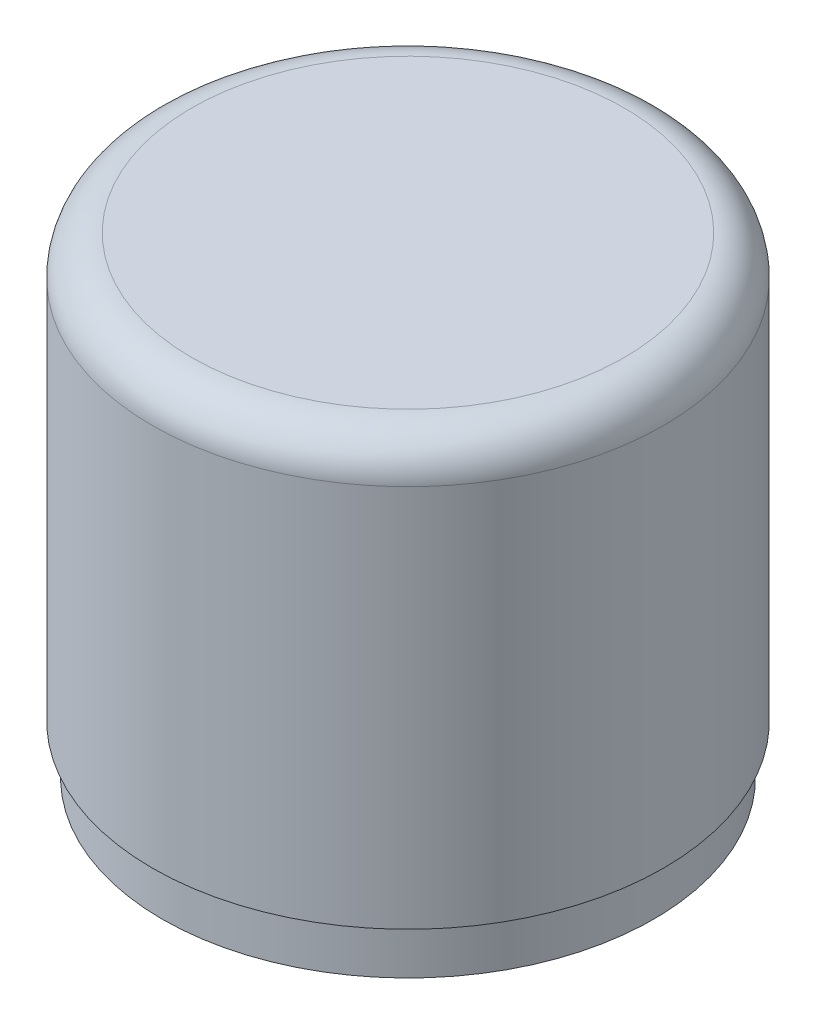
ISO-10303-21;
HEADER;
FILE_DESCRIPTION(('STEP AP214'),'2;1');
FILE_NAME('part.step','',(''),(''),'','','');
FILE_SCHEMA(('AUTOMOTIVE_DESIGN { 1 0 10303 214 1 1 1 1 }'));
ENDSEC;
DATA;
#1=APPLICATION_CONTEXT('core data for automotive mechanical design processes');
#2=APPLICATION_PROTOCOL_DEFINITION('international standard','automotive_design',2000,#1);
#3=PRODUCT_CONTEXT('',#1,'mechanical');
#4=PRODUCT('Part','Part','',(#3));
#5=PRODUCT_RELATED_PRODUCT_CATEGORY('part','',(#4));
#6=PRODUCT_DEFINITION_FORMATION('','',#4);
#7=PRODUCT_DEFINITION_CONTEXT('part definition',#1,'design');
#8=PRODUCT_DEFINITION('design','',#6,#7);
#9=PRODUCT_DEFINITION_SHAPE('','',#8);
#10=(LENGTH_UNIT() NAMED_UNIT(*) SI_UNIT(.MILLI.,.METRE.));
#11=(NAMED_UNIT(*) PLANE_ANGLE_UNIT() SI_UNIT($,.RADIAN.));
#12=(NAMED_UNIT(*) SI_UNIT($,.STERADIAN.) SOLID_ANGLE_UNIT());
#13=UNCERTAINTY_MEASURE_WITH_UNIT(LENGTH_MEASURE(1.E-05),#10,'distance_accuracy_value','');
#14=(GEOMETRIC_REPRESENTATION_CONTEXT(3) GLOBAL_UNCERTAINTY_ASSIGNED_CONTEXT((#13)) GLOBAL_UNIT_ASSIGNED_CONTEXT((#10,
#11,#12)) REPRESENTATION_CONTEXT('',''));
#15=CARTESIAN_POINT('',(0.,0.,0.));
#16=DIRECTION('',(0.,0.,1.));
#17=DIRECTION('',(1.,0.,0.));
#18=AXIS2_PLACEMENT_3D('',#15,#16,#17);
#19=CARTESIAN_POINT('',(0.,43.,0.));
#20=DIRECTION('',(0.,-1.,0.));
#21=DIRECTION('',(0.,0.,-1.));
#22=AXIS2_PLACEMENT_3D('',#19,#20,#21);
#23=CYLINDRICAL_SURFACE('',#22,26.);
#24=CARTESIAN_POINT('',(0.,39.,0.));
#25=DIRECTION('',(0.,1.,0.));
#26=DIRECTION('',(0.,0.,1.));
#27=AXIS2_PLACEMENT_3D('',#24,#25,#26);
#28=CIRCLE('',#27,26.);
#29=CARTESIAN_POINT('',(0.,39.,26.));
#30=VERTEX_POINT('',#29);
#31=EDGE_CURVE('E10',#30,#30,#28,.F.);
#32=ORIENTED_EDGE('',*,*,#31,.T.);
#33=EDGE_LOOP('',(#32));
#34=FACE_BOUND('',#33,.T.);
#35=CARTESIAN_POINT('',(0.,0.,0.));
#36=DIRECTION('',(0.,1.,0.));
#37=DIRECTION('',(0.,0.,1.));
#38=AXIS2_PLACEMENT_3D('',#35,#36,#37);
#39=CIRCLE('',#38,26.);
#40=CARTESIAN_POINT('',(0.,0.,26.));
#41=VERTEX_POINT('',#40);
#42=EDGE_CURVE('E55',#41,#41,#39,.T.);
#43=ORIENTED_EDGE('',*,*,#42,.T.);
#44=EDGE_LOOP('',(#43));
#45=FACE_BOUND('',#44,.T.);
#46=ADVANCED_FACE('F40',(#34,#45),#23,.T.);
#47=CARTESIAN_POINT('',(0.,43.,0.));
#48=DIRECTION('',(0.,1.,0.));
#49=DIRECTION('',(0.,0.,1.));
#50=AXIS2_PLACEMENT_3D('',#47,#48,#49);
#51=PLANE('',#50);
#52=CARTESIAN_POINT('',(0.,43.,0.));
#53=DIRECTION('',(0.,1.,0.));
#54=DIRECTION('',(0.,0.,1.));
#55=AXIS2_PLACEMENT_3D('',#52,#53,#54);
#56=CIRCLE('',#55,22.);
#57=CARTESIAN_POINT('',(0.,43.,22.));
#58=VERTEX_POINT('',#57);
#59=EDGE_CURVE('E47',#58,#58,#56,.T.);
#60=ORIENTED_EDGE('',*,*,#59,.T.);
#61=EDGE_LOOP('',(#60));
#62=FACE_BOUND('',#61,.T.);
#63=ADVANCED_FACE('F93',(#62),#51,.T.);
#64=CARTESIAN_POINT('',(0.,0.,0.));
#65=DIRECTION('',(0.,1.,0.));
#66=DIRECTION('',(0.,0.,1.));
#67=AXIS2_PLACEMENT_3D('',#64,#65,#66);
#68=PLANE('',#67);
#69=CARTESIAN_POINT('',(0.,0.,0.));
#70=DIRECTION('',(0.,-1.,0.));
#71=DIRECTION('',(0.,0.,-1.));
#72=AXIS2_PLACEMENT_3D('',#69,#70,#71);
#73=CIRCLE('',#72,25.);
#74=CARTESIAN_POINT('',(0.,0.,-25.));
#75=VERTEX_POINT('',#74);
#76=EDGE_CURVE('E51',#75,#75,#73,.T.);
#77=ORIENTED_EDGE('',*,*,#76,.F.);
#78=EDGE_LOOP('',(#77));
#79=FACE_BOUND('',#78,.T.);
#80=ORIENTED_EDGE('',*,*,#42,.F.);
#81=EDGE_LOOP('',(#80));
#82=FACE_BOUND('',#81,.T.);
#83=ADVANCED_FACE('F87',(#79,#82),#68,.F.);
#84=CARTESIAN_POINT('',(0.,-5.,0.));
#85=DIRECTION('',(0.,1.,0.));
#86=DIRECTION('',(0.,0.,1.));
#87=AXIS2_PLACEMENT_3D('',#84,#85,#86);
#88=CYLINDRICAL_SURFACE('',#87,25.);
#89=CARTESIAN_POINT('',(0.,-5.,0.));
#90=DIRECTION('',(0.,-1.,0.));
#91=DIRECTION('',(0.,0.,-1.));
#92=AXIS2_PLACEMENT_3D('',#89,#90,#91);
#93=CIRCLE('',#92,25.);
#94=CARTESIAN_POINT('',(0.,-5.,-25.));
#95=VERTEX_POINT('',#94);
#96=EDGE_CURVE('E59',#95,#95,#93,.T.);
#97=ORIENTED_EDGE('',*,*,#96,.F.);
#98=EDGE_LOOP('',(#97));
#99=FACE_BOUND('',#98,.T.);
#100=ORIENTED_EDGE('',*,*,#76,.T.);
#101=EDGE_LOOP('',(#100));
#102=FACE_BOUND('',#101,.T.);
#103=ADVANCED_FACE('F81',(#99,#102),#88,.T.);
#104=CARTESIAN_POINT('',(0.,-5.,0.));
#105=DIRECTION('',(0.,-1.,0.));
#106=DIRECTION('',(0.,0.,-1.));
#107=AXIS2_PLACEMENT_3D('',#104,#105,#106);
#108=PLANE('',#107);
#109=CARTESIAN_POINT('',(0.,-5.,0.));
#110=DIRECTION('',(0.,-1.,0.));
#111=DIRECTION('',(0.,0.,-1.));
#112=AXIS2_PLACEMENT_3D('',#109,#110,#111);
#113=CIRCLE('',#112,24.1458786133638);
#114=CARTESIAN_POINT('',(0.,-5.,-24.1458786133638));
#115=VERTEX_POINT('',#114);
#116=EDGE_CURVE('E64',#115,#115,#113,.T.);
#117=ORIENTED_EDGE('',*,*,#116,.F.);
#118=EDGE_LOOP('',(#117));
#119=FACE_BOUND('',#118,.T.);
#120=ORIENTED_EDGE('',*,*,#96,.T.);
#121=EDGE_LOOP('',(#120));
#122=FACE_BOUND('',#121,.T.);
#123=ADVANCED_FACE('F75',(#119,#122),#108,.T.);
#124=CARTESIAN_POINT('',(0.,39.,0.));
#125=DIRECTION('',(0.,-1.,0.));
#126=DIRECTION('',(0.,0.,-1.));
#127=AXIS2_PLACEMENT_3D('',#124,#125,#126);
#128=CYLINDRICAL_SURFACE('',#127,24.1458786133638);
#129=CARTESIAN_POINT('',(0.,39.,0.));
#130=DIRECTION('',(0.,-1.,0.));
#131=DIRECTION('',(0.,0.,-1.));
#132=AXIS2_PLACEMENT_3D('',#129,#130,#131);
#133=CIRCLE('',#132,24.1458786133638);
#134=CARTESIAN_POINT('',(0.,39.,-24.1458786133638));
#135=VERTEX_POINT('',#134);
#136=EDGE_CURVE('E63',#135,#135,#133,.T.);
#137=ORIENTED_EDGE('',*,*,#136,.F.);
#138=EDGE_LOOP('',(#137));
#139=FACE_BOUND('',#138,.T.);
#140=ORIENTED_EDGE('',*,*,#116,.T.);
#141=EDGE_LOOP('',(#140));
#142=FACE_BOUND('',#141,.T.);
#143=ADVANCED_FACE('F72',(#139,#142),#128,.F.);
#144=CARTESIAN_POINT('',(0.,39.,0.));
#145=DIRECTION('',(0.,-1.,0.));
#146=DIRECTION('',(0.,0.,-1.));
#147=AXIS2_PLACEMENT_3D('',#144,#145,#146);
#148=PLANE('',#147);
#149=ORIENTED_EDGE('',*,*,#136,.T.);
#150=EDGE_LOOP('',(#149));
#151=FACE_BOUND('',#150,.T.);
#152=ADVANCED_FACE('F70',(#151),#148,.T.);
#153=CARTESIAN_POINT('',(0.,39.,0.));
#154=DIRECTION('',(0.,1.,0.));
#155=DIRECTION('',(0.,0.,1.));
#156=AXIS2_PLACEMENT_3D('',#153,#154,#155);
#157=TOROIDAL_SURFACE('',#156,22.,4.);
#158=ORIENTED_EDGE('',*,*,#31,.F.);
#159=EDGE_LOOP('',(#158));
#160=FACE_BOUND('',#159,.T.);
#161=ORIENTED_EDGE('',*,*,#59,.F.);
#162=EDGE_LOOP('',(#161));
#163=FACE_BOUND('',#162,.T.);
#164=ADVANCED_FACE('F42',(#160,#163),#157,.T.);
#165=CLOSED_SHELL('',(#46,#63,#83,#103,#123,#143,#152,#164));
#166=MANIFOLD_SOLID_BREP('B2',#165);
#167=ADVANCED_BREP_SHAPE_REPRESENTATION('',(#18,#166),#14);
#168=SHAPE_DEFINITION_REPRESENTATION(#9,#167);
ENDSEC;
END-ISO-10303-21;
